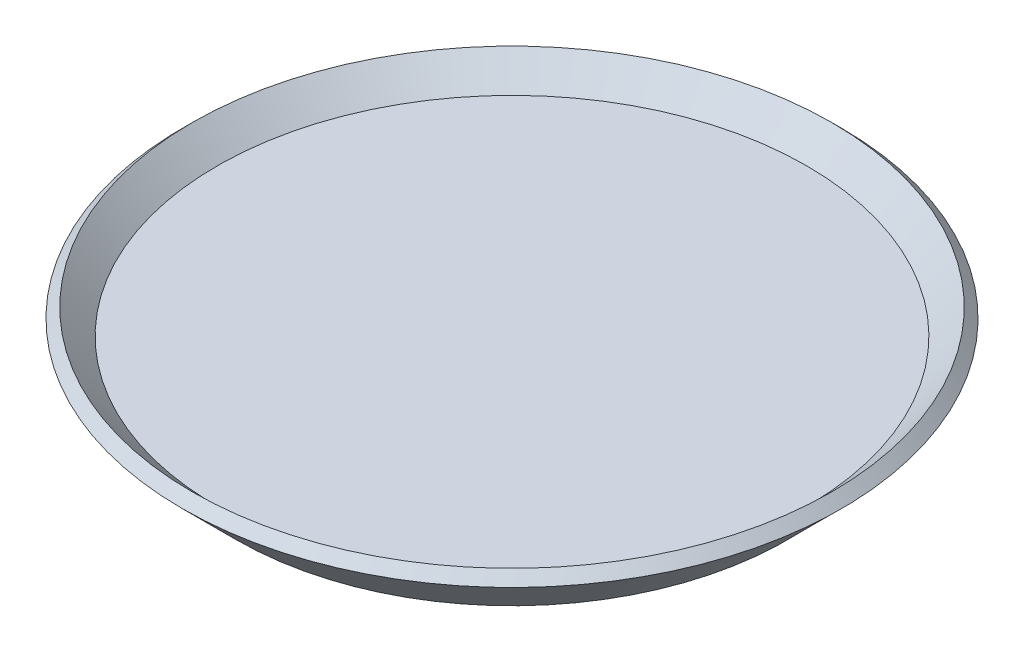
ISO-10303-21;
HEADER;
FILE_DESCRIPTION(('STEP AP214'),'2;1');
FILE_NAME('part.step','',(''),(''),'','','');
FILE_SCHEMA(('AUTOMOTIVE_DESIGN { 1 0 10303 214 1 1 1 1 }'));
ENDSEC;
DATA;
#1=APPLICATION_CONTEXT('core data for automotive mechanical design processes');
#2=APPLICATION_PROTOCOL_DEFINITION('international standard','automotive_design',2000,#1);
#3=PRODUCT_CONTEXT('',#1,'mechanical');
#4=PRODUCT('Part','Part','',(#3));
#5=PRODUCT_RELATED_PRODUCT_CATEGORY('part','',(#4));
#6=PRODUCT_DEFINITION_FORMATION('','',#4);
#7=PRODUCT_DEFINITION_CONTEXT('part definition',#1,'design');
#8=PRODUCT_DEFINITION('design','',#6,#7);
#9=PRODUCT_DEFINITION_SHAPE('','',#8);
#10=(LENGTH_UNIT() NAMED_UNIT(*) SI_UNIT(.MILLI.,.METRE.));
#11=(NAMED_UNIT(*) PLANE_ANGLE_UNIT() SI_UNIT($,.RADIAN.));
#12=(NAMED_UNIT(*) SI_UNIT($,.STERADIAN.) SOLID_ANGLE_UNIT());
#13=UNCERTAINTY_MEASURE_WITH_UNIT(LENGTH_MEASURE(1.E-05),#10,'distance_accuracy_value','');
#14=(GEOMETRIC_REPRESENTATION_CONTEXT(3) GLOBAL_UNCERTAINTY_ASSIGNED_CONTEXT((#13)) GLOBAL_UNIT_ASSIGNED_CONTEXT((#10,
#11,#12)) REPRESENTATION_CONTEXT('',''));
#15=CARTESIAN_POINT('',(0.,0.,0.));
#16=DIRECTION('',(0.,0.,1.));
#17=DIRECTION('',(1.,0.,0.));
#18=AXIS2_PLACEMENT_3D('',#15,#16,#17);
#19=CARTESIAN_POINT('',(0.,0.,0.));
#20=DIRECTION('',(0.,-1.,0.));
#21=DIRECTION('',(0.,0.,-1.));
#22=AXIS2_PLACEMENT_3D('',#19,#20,#21);
#23=PLANE('',#22);
#24=CARTESIAN_POINT('',(0.,0.,0.));
#25=DIRECTION('',(0.,-1.,0.));
#26=DIRECTION('',(0.,0.,-1.));
#27=AXIS2_PLACEMENT_3D('',#24,#25,#26);
#28=CIRCLE('',#27,100.);
#29=CARTESIAN_POINT('',(0.,0.,-100.));
#30=VERTEX_POINT('',#29);
#31=EDGE_CURVE('E10',#30,#30,#28,.T.);
#32=ORIENTED_EDGE('',*,*,#31,.T.);
#33=EDGE_LOOP('',(#32));
#34=FACE_BOUND('',#33,.T.);
#35=ADVANCED_FACE('F30',(#34),#23,.T.);
#36=CARTESIAN_POINT('',(0.,0.,0.));
#37=DIRECTION('',(0.,1.,0.));
#38=DIRECTION('',(0.,0.,1.));
#39=AXIS2_PLACEMENT_3D('',#36,#37,#38);
#40=CONICAL_SURFACE('',#39,100.,0.785398163397447);
#41=CARTESIAN_POINT('',(0.,19.618340286095,0.));
#42=DIRECTION('',(0.,-1.,0.));
#43=DIRECTION('',(0.,0.,-1.));
#44=AXIS2_PLACEMENT_3D('',#41,#42,#43);
#45=CIRCLE('',#44,119.618340286095);
#46=CARTESIAN_POINT('',(0.,19.618340286095,-119.618340286095));
#47=VERTEX_POINT('',#46);
#48=EDGE_CURVE('E36',#47,#47,#45,.T.);
#49=ORIENTED_EDGE('',*,*,#48,.T.);
#50=EDGE_LOOP('',(#49));
#51=FACE_BOUND('',#50,.T.);
#52=ORIENTED_EDGE('',*,*,#31,.F.);
#53=EDGE_LOOP('',(#52));
#54=FACE_BOUND('',#53,.T.);
#55=ADVANCED_FACE('F62',(#51,#54),#40,.T.);
#56=CARTESIAN_POINT('',(0.,19.618340286095,0.));
#57=DIRECTION('',(0.,-1.,0.));
#58=DIRECTION('',(0.,0.,-1.));
#59=AXIS2_PLACEMENT_3D('',#56,#57,#58);
#60=CONICAL_SURFACE('',#59,119.618340286095,0.785398163397462);
#61=CARTESIAN_POINT('',(0.,23.1538741920277,0.));
#62=DIRECTION('',(0.,-1.,0.));
#63=DIRECTION('',(0.,0.,-1.));
#64=AXIS2_PLACEMENT_3D('',#61,#62,#63);
#65=CIRCLE('',#64,116.082806380162);
#66=CARTESIAN_POINT('',(0.,23.1538741920277,-116.082806380162));
#67=VERTEX_POINT('',#66);
#68=EDGE_CURVE('E40',#67,#67,#65,.T.);
#69=ORIENTED_EDGE('',*,*,#68,.T.);
#70=EDGE_LOOP('',(#69));
#71=FACE_BOUND('',#70,.T.);
#72=ORIENTED_EDGE('',*,*,#48,.F.);
#73=EDGE_LOOP('',(#72));
#74=FACE_BOUND('',#73,.T.);
#75=ADVANCED_FACE('F59',(#71,#74),#60,.T.);
#76=CARTESIAN_POINT('',(0.,23.1538741920277,0.));
#77=DIRECTION('',(0.,1.,0.));
#78=DIRECTION('',(0.,0.,1.));
#79=AXIS2_PLACEMENT_3D('',#76,#77,#78);
#80=CONICAL_SURFACE('',#79,116.082806380162,0.785398163397447);
#81=CARTESIAN_POINT('',(0.,14.0769370960138,0.));
#82=DIRECTION('',(0.,-1.,0.));
#83=DIRECTION('',(0.,0.,-1.));
#84=AXIS2_PLACEMENT_3D('',#81,#82,#83);
#85=CIRCLE('',#84,107.005869284148);
#86=CARTESIAN_POINT('',(0.,14.0769370960138,-107.005869284148));
#87=VERTEX_POINT('',#86);
#88=EDGE_CURVE('E44',#87,#87,#85,.T.);
#89=ORIENTED_EDGE('',*,*,#88,.T.);
#90=EDGE_LOOP('',(#89));
#91=FACE_BOUND('',#90,.T.);
#92=ORIENTED_EDGE('',*,*,#68,.F.);
#93=EDGE_LOOP('',(#92));
#94=FACE_BOUND('',#93,.T.);
#95=ADVANCED_FACE('F50',(#91,#94),#80,.F.);
#96=CARTESIAN_POINT('',(107.005869284148,14.0769370960138,0.));
#97=DIRECTION('',(0.,1.,0.));
#98=DIRECTION('',(0.,0.,1.));
#99=AXIS2_PLACEMENT_3D('',#96,#97,#98);
#100=PLANE('',#99);
#101=ORIENTED_EDGE('',*,*,#88,.F.);
#102=EDGE_LOOP('',(#101));
#103=FACE_BOUND('',#102,.T.);
#104=ADVANCED_FACE('F53',(#103),#100,.T.);
#105=CLOSED_SHELL('',(#35,#55,#75,#95,#104));
#106=MANIFOLD_SOLID_BREP('B2',#105);
#107=ADVANCED_BREP_SHAPE_REPRESENTATION('',(#18,#106),#14);
#108=SHAPE_DEFINITION_REPRESENTATION(#9,#107);
ENDSEC;
END-ISO-10303-21;
